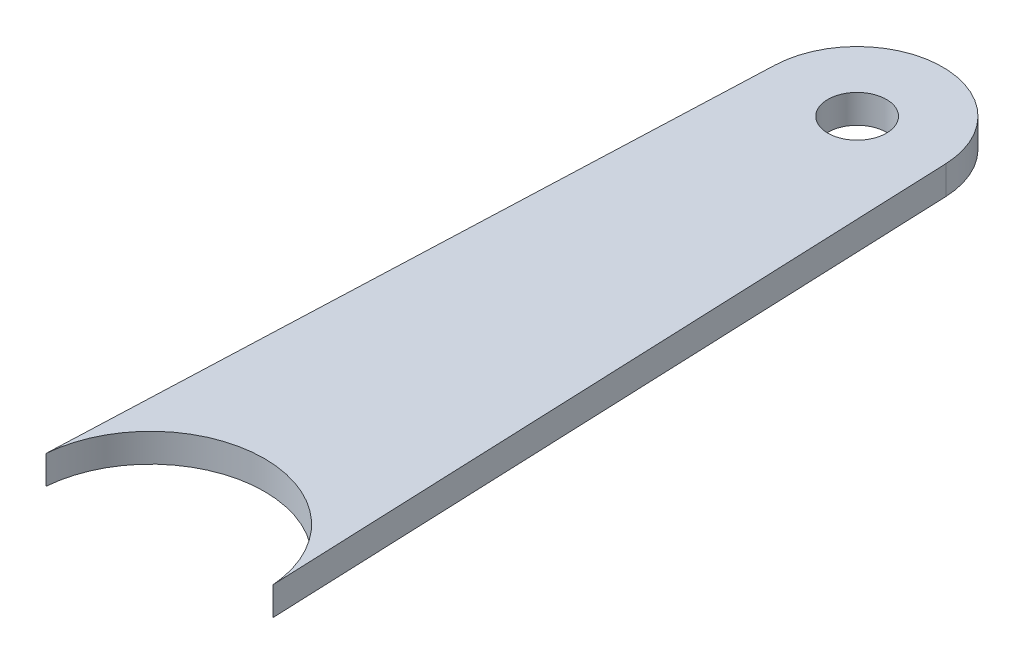
ISO-10303-21;
HEADER;
FILE_DESCRIPTION(('STEP AP214'),'2;1');
FILE_NAME('part.step','',(''),(''),'','','');
FILE_SCHEMA(('AUTOMOTIVE_DESIGN { 1 0 10303 214 1 1 1 1 }'));
ENDSEC;
DATA;
#1=APPLICATION_CONTEXT('core data for automotive mechanical design processes');
#2=APPLICATION_PROTOCOL_DEFINITION('international standard','automotive_design',2000,#1);
#3=PRODUCT_CONTEXT('',#1,'mechanical');
#4=PRODUCT('Part','Part','',(#3));
#5=PRODUCT_RELATED_PRODUCT_CATEGORY('part','',(#4));
#6=PRODUCT_DEFINITION_FORMATION('','',#4);
#7=PRODUCT_DEFINITION_CONTEXT('part definition',#1,'design');
#8=PRODUCT_DEFINITION('design','',#6,#7);
#9=PRODUCT_DEFINITION_SHAPE('','',#8);
#10=(LENGTH_UNIT() NAMED_UNIT(*) SI_UNIT(.MILLI.,.METRE.));
#11=(NAMED_UNIT(*) PLANE_ANGLE_UNIT() SI_UNIT($,.RADIAN.));
#12=(NAMED_UNIT(*) SI_UNIT($,.STERADIAN.) SOLID_ANGLE_UNIT());
#13=UNCERTAINTY_MEASURE_WITH_UNIT(LENGTH_MEASURE(1.E-05),#10,'distance_accuracy_value','');
#14=(GEOMETRIC_REPRESENTATION_CONTEXT(3) GLOBAL_UNCERTAINTY_ASSIGNED_CONTEXT((#13)) GLOBAL_UNIT_ASSIGNED_CONTEXT((#10,
#11,#12)) REPRESENTATION_CONTEXT('',''));
#15=CARTESIAN_POINT('',(0.,0.,0.));
#16=DIRECTION('',(0.,0.,1.));
#17=DIRECTION('',(1.,0.,0.));
#18=AXIS2_PLACEMENT_3D('',#15,#16,#17);
#19=CARTESIAN_POINT('',(12.7,3.175,0.));
#20=DIRECTION('',(0.,-1.,0.));
#21=DIRECTION('',(0.,0.,-1.));
#22=AXIS2_PLACEMENT_3D('',#19,#20,#21);
#23=CYLINDRICAL_SURFACE('',#22,12.7);
#24=CARTESIAN_POINT('',(12.7,0.,0.));
#25=DIRECTION('',(0.,1.,0.));
#26=DIRECTION('',(0.,0.,1.));
#27=AXIS2_PLACEMENT_3D('',#24,#25,#26);
#28=CIRCLE('',#27,12.7);
#29=CARTESIAN_POINT('',(25.3589841805605,0.,-1.01986249873176));
#30=VERTEX_POINT('',#29);
#31=CARTESIAN_POINT('',(0.041015819439518,0.,-1.01986249873184));
#32=VERTEX_POINT('',#31);
#33=EDGE_CURVE('E120',#30,#32,#28,.T.);
#34=ORIENTED_EDGE('',*,*,#33,.F.);
#35=DIRECTION('',(0.,-1.,0.));
#36=VECTOR('',#35,1.);
#37=CARTESIAN_POINT('',(25.3589841805605,3.175,-1.01986249873176));
#38=LINE('',#37,#36);
#39=CARTESIAN_POINT('',(25.3589841805605,3.175,-1.01986249873176));
#40=VERTEX_POINT('',#39);
#41=EDGE_CURVE('E11',#40,#30,#38,.T.);
#42=ORIENTED_EDGE('',*,*,#41,.F.);
#43=CARTESIAN_POINT('',(12.7,3.175,0.));
#44=DIRECTION('',(0.,1.,0.));
#45=DIRECTION('',(0.,0.,1.));
#46=AXIS2_PLACEMENT_3D('',#43,#44,#45);
#47=CIRCLE('',#46,12.7);
#48=CARTESIAN_POINT('',(0.041015819439518,3.175,-1.01986249873184));
#49=VERTEX_POINT('',#48);
#50=EDGE_CURVE('E97',#40,#49,#47,.T.);
#51=ORIENTED_EDGE('',*,*,#50,.T.);
#52=DIRECTION('',(0.,-1.,0.));
#53=VECTOR('',#52,1.);
#54=CARTESIAN_POINT('',(0.041015819439518,3.175,-1.01986249873184));
#55=LINE('',#54,#53);
#56=EDGE_CURVE('E64',#49,#32,#55,.T.);
#57=ORIENTED_EDGE('',*,*,#56,.T.);
#58=EDGE_LOOP('',(#34,#42,#51,#57));
#59=FACE_BOUND('',#58,.T.);
#60=ADVANCED_FACE('F47',(#59),#23,.F.);
#61=CARTESIAN_POINT('',(25.3589841805605,3.175,-1.01986249873184));
#62=DIRECTION('',(-0.999192275770321,0.,0.0401845248936208));
#63=DIRECTION('',(0.0401845248936208,0.,0.999192275770322));
#64=AXIS2_PLACEMENT_3D('',#61,#62,#63);
#65=PLANE('',#64);
#66=DIRECTION('',(-0.0401845248936208,0.,-0.999192275770322));
#67=VECTOR('',#66,1.);
#68=CARTESIAN_POINT('',(25.3589841805605,0.,-1.01986249873184));
#69=LINE('',#68,#67);
#70=CARTESIAN_POINT('',(22.2173064267123,0.,-79.1379975996117));
#71=VERTEX_POINT('',#70);
#72=EDGE_CURVE('E104',#30,#71,#69,.T.);
#73=ORIENTED_EDGE('',*,*,#72,.T.);
#74=DIRECTION('',(0.,-1.,0.));
#75=VECTOR('',#74,1.);
#76=CARTESIAN_POINT('',(22.2173064267123,3.175,-79.1379975996117));
#77=LINE('',#76,#75);
#78=CARTESIAN_POINT('',(22.2173064267123,3.175,-79.1379975996117));
#79=VERTEX_POINT('',#78);
#80=EDGE_CURVE('E56',#79,#71,#77,.T.);
#81=ORIENTED_EDGE('',*,*,#80,.F.);
#82=DIRECTION('',(-0.0401845248936208,0.,-0.999192275770322));
#83=VECTOR('',#82,1.);
#84=CARTESIAN_POINT('',(25.3589841805605,3.175,-1.01986249873184));
#85=LINE('',#84,#83);
#86=EDGE_CURVE('E90',#40,#79,#85,.T.);
#87=ORIENTED_EDGE('',*,*,#86,.F.);
#88=ORIENTED_EDGE('',*,*,#41,.T.);
#89=EDGE_LOOP('',(#73,#81,#87,#88));
#90=FACE_BOUND('',#89,.T.);
#91=ADVANCED_FACE('F102',(#90),#65,.F.);
#92=CARTESIAN_POINT('',(12.7,3.175,-78.75524));
#93=DIRECTION('',(0.,-1.,0.));
#94=DIRECTION('',(0.,0.,-1.));
#95=AXIS2_PLACEMENT_3D('',#92,#93,#94);
#96=CYLINDRICAL_SURFACE('',#95,9.525);
#97=CARTESIAN_POINT('',(12.7,0.,-78.75524));
#98=DIRECTION('',(0.,1.,0.));
#99=DIRECTION('',(0.,0.,1.));
#100=AXIS2_PLACEMENT_3D('',#97,#98,#99);
#101=CIRCLE('',#100,9.525);
#102=CARTESIAN_POINT('',(3.18269357328769,0.,-79.1379975996117));
#103=VERTEX_POINT('',#102);
#104=EDGE_CURVE('E125',#71,#103,#101,.T.);
#105=ORIENTED_EDGE('',*,*,#104,.T.);
#106=DIRECTION('',(0.,-1.,0.));
#107=VECTOR('',#106,1.);
#108=CARTESIAN_POINT('',(3.18269357328769,3.175,-79.1379975996117));
#109=LINE('',#108,#107);
#110=CARTESIAN_POINT('',(3.18269357328769,3.175,-79.1379975996117));
#111=VERTEX_POINT('',#110);
#112=EDGE_CURVE('E78',#111,#103,#109,.T.);
#113=ORIENTED_EDGE('',*,*,#112,.F.);
#114=CARTESIAN_POINT('',(12.7,3.175,-78.75524));
#115=DIRECTION('',(0.,1.,0.));
#116=DIRECTION('',(0.,0.,1.));
#117=AXIS2_PLACEMENT_3D('',#114,#115,#116);
#118=CIRCLE('',#117,9.525);
#119=EDGE_CURVE('E96',#79,#111,#118,.T.);
#120=ORIENTED_EDGE('',*,*,#119,.F.);
#121=ORIENTED_EDGE('',*,*,#80,.T.);
#122=EDGE_LOOP('',(#105,#113,#120,#121));
#123=FACE_BOUND('',#122,.T.);
#124=ADVANCED_FACE('F108',(#123),#96,.T.);
#125=CARTESIAN_POINT('',(0.,3.175,0.));
#126=DIRECTION('',(-0.999192275770321,0.,-0.0401845248936208));
#127=DIRECTION('',(-0.0401845248936208,0.,0.999192275770322));
#128=AXIS2_PLACEMENT_3D('',#125,#126,#127);
#129=PLANE('',#128);
#130=DIRECTION('',(0.0401845248936208,0.,-0.999192275770322));
#131=VECTOR('',#130,1.);
#132=CARTESIAN_POINT('',(0.,0.,0.));
#133=LINE('',#132,#131);
#134=EDGE_CURVE('E128',#32,#103,#133,.T.);
#135=ORIENTED_EDGE('',*,*,#134,.F.);
#136=ORIENTED_EDGE('',*,*,#56,.F.);
#137=DIRECTION('',(0.0401845248936208,0.,-0.999192275770322));
#138=VECTOR('',#137,1.);
#139=CARTESIAN_POINT('',(0.,3.175,0.));
#140=LINE('',#139,#138);
#141=EDGE_CURVE('E110',#49,#111,#140,.T.);
#142=ORIENTED_EDGE('',*,*,#141,.T.);
#143=ORIENTED_EDGE('',*,*,#112,.T.);
#144=EDGE_LOOP('',(#135,#136,#142,#143));
#145=FACE_BOUND('',#144,.T.);
#146=ADVANCED_FACE('F142',(#145),#129,.T.);
#147=CARTESIAN_POINT('',(12.7,3.175,-78.75524));
#148=DIRECTION('',(0.,-1.,0.));
#149=DIRECTION('',(0.,0.,-1.));
#150=AXIS2_PLACEMENT_3D('',#147,#148,#149);
#151=CYLINDRICAL_SURFACE('',#150,3.2639);
#152=CARTESIAN_POINT('',(12.7,3.175,-78.75524));
#153=DIRECTION('',(0.,1.,0.));
#154=DIRECTION('',(0.,0.,1.));
#155=AXIS2_PLACEMENT_3D('',#152,#153,#154);
#156=CIRCLE('',#155,3.2639);
#157=CARTESIAN_POINT('',(12.7,3.175,-75.49134));
#158=VERTEX_POINT('',#157);
#159=EDGE_CURVE('E113',#158,#158,#156,.T.);
#160=ORIENTED_EDGE('',*,*,#159,.T.);
#161=EDGE_LOOP('',(#160));
#162=FACE_BOUND('',#161,.T.);
#163=CARTESIAN_POINT('',(12.7,0.,-78.75524));
#164=DIRECTION('',(0.,1.,0.));
#165=DIRECTION('',(0.,0.,1.));
#166=AXIS2_PLACEMENT_3D('',#163,#164,#165);
#167=CIRCLE('',#166,3.2639);
#168=CARTESIAN_POINT('',(12.7,0.,-75.49134));
#169=VERTEX_POINT('',#168);
#170=EDGE_CURVE('E132',#169,#169,#167,.T.);
#171=ORIENTED_EDGE('',*,*,#170,.F.);
#172=EDGE_LOOP('',(#171));
#173=FACE_BOUND('',#172,.T.);
#174=ADVANCED_FACE('F144',(#162,#173),#151,.F.);
#175=CARTESIAN_POINT('',(0.,3.175,0.));
#176=DIRECTION('',(0.,1.,0.));
#177=DIRECTION('',(0.,0.,1.));
#178=AXIS2_PLACEMENT_3D('',#175,#176,#177);
#179=PLANE('',#178);
#180=ORIENTED_EDGE('',*,*,#50,.F.);
#181=ORIENTED_EDGE('',*,*,#86,.T.);
#182=ORIENTED_EDGE('',*,*,#119,.T.);
#183=ORIENTED_EDGE('',*,*,#141,.F.);
#184=EDGE_LOOP('',(#180,#181,#182,#183));
#185=FACE_BOUND('',#184,.T.);
#186=ORIENTED_EDGE('',*,*,#159,.F.);
#187=EDGE_LOOP('',(#186));
#188=FACE_BOUND('',#187,.T.);
#189=ADVANCED_FACE('F92',(#185,#188),#179,.T.);
#190=CARTESIAN_POINT('',(0.,0.,0.));
#191=DIRECTION('',(0.,1.,0.));
#192=DIRECTION('',(0.,0.,1.));
#193=AXIS2_PLACEMENT_3D('',#190,#191,#192);
#194=PLANE('',#193);
#195=ORIENTED_EDGE('',*,*,#33,.T.);
#196=ORIENTED_EDGE('',*,*,#134,.T.);
#197=ORIENTED_EDGE('',*,*,#104,.F.);
#198=ORIENTED_EDGE('',*,*,#72,.F.);
#199=EDGE_LOOP('',(#195,#196,#197,#198));
#200=FACE_BOUND('',#199,.T.);
#201=ORIENTED_EDGE('',*,*,#170,.T.);
#202=EDGE_LOOP('',(#201));
#203=FACE_BOUND('',#202,.T.);
#204=ADVANCED_FACE('F184',(#200,#203),#194,.F.);
#205=CLOSED_SHELL('',(#60,#91,#124,#146,#174,#189,#204));
#206=MANIFOLD_SOLID_BREP('B2',#205);
#207=ADVANCED_BREP_SHAPE_REPRESENTATION('',(#18,#206),#14);
#208=SHAPE_DEFINITION_REPRESENTATION(#9,#207);
ENDSEC;
END-ISO-10303-21;
